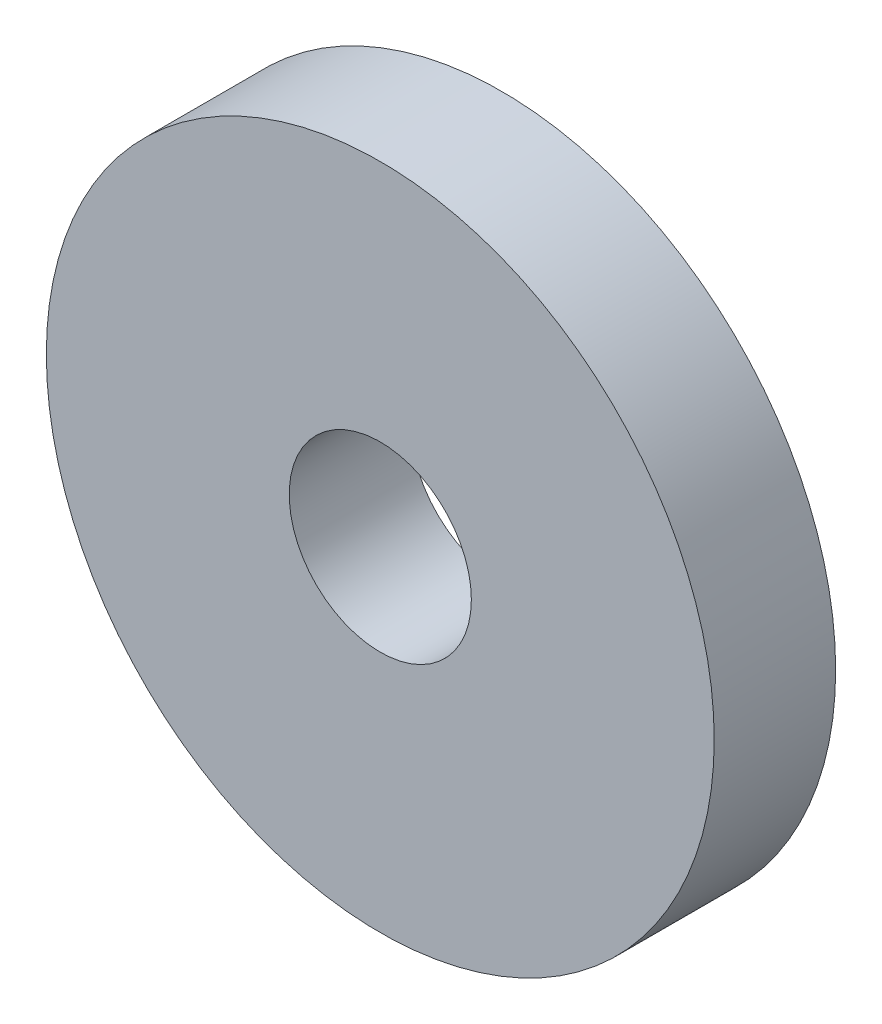
ISO-10303-21;
HEADER;
FILE_DESCRIPTION(('STEP AP214'),'2;1');
FILE_NAME('part.step','',(''),(''),'','','');
FILE_SCHEMA(('AUTOMOTIVE_DESIGN { 1 0 10303 214 1 1 1 1 }'));
ENDSEC;
DATA;
#1=APPLICATION_CONTEXT('core data for automotive mechanical design processes');
#2=APPLICATION_PROTOCOL_DEFINITION('international standard','automotive_design',2000,#1);
#3=PRODUCT_CONTEXT('',#1,'mechanical');
#4=PRODUCT('Part','Part','',(#3));
#5=PRODUCT_RELATED_PRODUCT_CATEGORY('part','',(#4));
#6=PRODUCT_DEFINITION_FORMATION('','',#4);
#7=PRODUCT_DEFINITION_CONTEXT('part definition',#1,'design');
#8=PRODUCT_DEFINITION('design','',#6,#7);
#9=PRODUCT_DEFINITION_SHAPE('','',#8);
#10=(LENGTH_UNIT() NAMED_UNIT(*) SI_UNIT(.MILLI.,.METRE.));
#11=(NAMED_UNIT(*) PLANE_ANGLE_UNIT() SI_UNIT($,.RADIAN.));
#12=(NAMED_UNIT(*) SI_UNIT($,.STERADIAN.) SOLID_ANGLE_UNIT());
#13=UNCERTAINTY_MEASURE_WITH_UNIT(LENGTH_MEASURE(1.E-05),#10,'distance_accuracy_value','');
#14=(GEOMETRIC_REPRESENTATION_CONTEXT(3) GLOBAL_UNCERTAINTY_ASSIGNED_CONTEXT((#13)) GLOBAL_UNIT_ASSIGNED_CONTEXT((#10,
#11,#12)) REPRESENTATION_CONTEXT('',''));
#15=CARTESIAN_POINT('',(0.,0.,0.));
#16=DIRECTION('',(0.,0.,1.));
#17=DIRECTION('',(1.,0.,0.));
#18=AXIS2_PLACEMENT_3D('',#15,#16,#17);
#19=CARTESIAN_POINT('',(0.,0.,2.));
#20=DIRECTION('',(0.,0.,-1.));
#21=DIRECTION('',(-1.,0.,0.));
#22=AXIS2_PLACEMENT_3D('',#19,#20,#21);
#23=CYLINDRICAL_SURFACE('',#22,5.5);
#24=CARTESIAN_POINT('',(0.,0.,2.));
#25=DIRECTION('',(0.,0.,1.));
#26=DIRECTION('',(1.,0.,0.));
#27=AXIS2_PLACEMENT_3D('',#24,#25,#26);
#28=CIRCLE('',#27,5.5);
#29=CARTESIAN_POINT('',(5.5,0.,2.));
#30=VERTEX_POINT('',#29);
#31=EDGE_CURVE('E10',#30,#30,#28,.T.);
#32=ORIENTED_EDGE('',*,*,#31,.F.);
#33=EDGE_LOOP('',(#32));
#34=FACE_BOUND('',#33,.T.);
#35=CARTESIAN_POINT('',(0.,0.,0.));
#36=DIRECTION('',(0.,0.,1.));
#37=DIRECTION('',(1.,0.,0.));
#38=AXIS2_PLACEMENT_3D('',#35,#36,#37);
#39=CIRCLE('',#38,5.5);
#40=CARTESIAN_POINT('',(5.5,0.,0.));
#41=VERTEX_POINT('',#40);
#42=EDGE_CURVE('E33',#41,#41,#39,.T.);
#43=ORIENTED_EDGE('',*,*,#42,.T.);
#44=EDGE_LOOP('',(#43));
#45=FACE_BOUND('',#44,.T.);
#46=ADVANCED_FACE('F27',(#34,#45),#23,.T.);
#47=CARTESIAN_POINT('',(0.,0.,2.));
#48=DIRECTION('',(0.,0.,1.));
#49=DIRECTION('',(1.,0.,0.));
#50=AXIS2_PLACEMENT_3D('',#47,#48,#49);
#51=PLANE('',#50);
#52=CARTESIAN_POINT('',(0.,0.,2.));
#53=DIRECTION('',(0.,0.,1.));
#54=DIRECTION('',(1.,0.,0.));
#55=AXIS2_PLACEMENT_3D('',#52,#53,#54);
#56=CIRCLE('',#55,1.5);
#57=CARTESIAN_POINT('',(1.5,0.,2.));
#58=VERTEX_POINT('',#57);
#59=EDGE_CURVE('E41',#58,#58,#56,.T.);
#60=ORIENTED_EDGE('',*,*,#59,.F.);
#61=EDGE_LOOP('',(#60));
#62=FACE_BOUND('',#61,.T.);
#63=ORIENTED_EDGE('',*,*,#31,.T.);
#64=EDGE_LOOP('',(#63));
#65=FACE_BOUND('',#64,.T.);
#66=ADVANCED_FACE('F49',(#62,#65),#51,.T.);
#67=CARTESIAN_POINT('',(0.,0.,0.));
#68=DIRECTION('',(0.,0.,1.));
#69=DIRECTION('',(1.,0.,0.));
#70=AXIS2_PLACEMENT_3D('',#67,#68,#69);
#71=PLANE('',#70);
#72=CARTESIAN_POINT('',(0.,0.,0.));
#73=DIRECTION('',(0.,0.,1.));
#74=DIRECTION('',(1.,0.,0.));
#75=AXIS2_PLACEMENT_3D('',#72,#73,#74);
#76=CIRCLE('',#75,1.5);
#77=CARTESIAN_POINT('',(1.5,0.,0.));
#78=VERTEX_POINT('',#77);
#79=EDGE_CURVE('E37',#78,#78,#76,.T.);
#80=ORIENTED_EDGE('',*,*,#79,.T.);
#81=EDGE_LOOP('',(#80));
#82=FACE_BOUND('',#81,.T.);
#83=ORIENTED_EDGE('',*,*,#42,.F.);
#84=EDGE_LOOP('',(#83));
#85=FACE_BOUND('',#84,.T.);
#86=ADVANCED_FACE('F51',(#82,#85),#71,.F.);
#87=CARTESIAN_POINT('',(0.,0.,0.));
#88=DIRECTION('',(0.,0.,1.));
#89=DIRECTION('',(1.,0.,0.));
#90=AXIS2_PLACEMENT_3D('',#87,#88,#89);
#91=CYLINDRICAL_SURFACE('',#90,1.5);
#92=ORIENTED_EDGE('',*,*,#79,.F.);
#93=EDGE_LOOP('',(#92));
#94=FACE_BOUND('',#93,.T.);
#95=ORIENTED_EDGE('',*,*,#59,.T.);
#96=EDGE_LOOP('',(#95));
#97=FACE_BOUND('',#96,.T.);
#98=ADVANCED_FACE('F47',(#94,#97),#91,.F.);
#99=CLOSED_SHELL('',(#46,#66,#86,#98));
#100=MANIFOLD_SOLID_BREP('B2',#99);
#101=ADVANCED_BREP_SHAPE_REPRESENTATION('',(#18,#100),#14);
#102=SHAPE_DEFINITION_REPRESENTATION(#9,#101);
ENDSEC;
END-ISO-10303-21;
